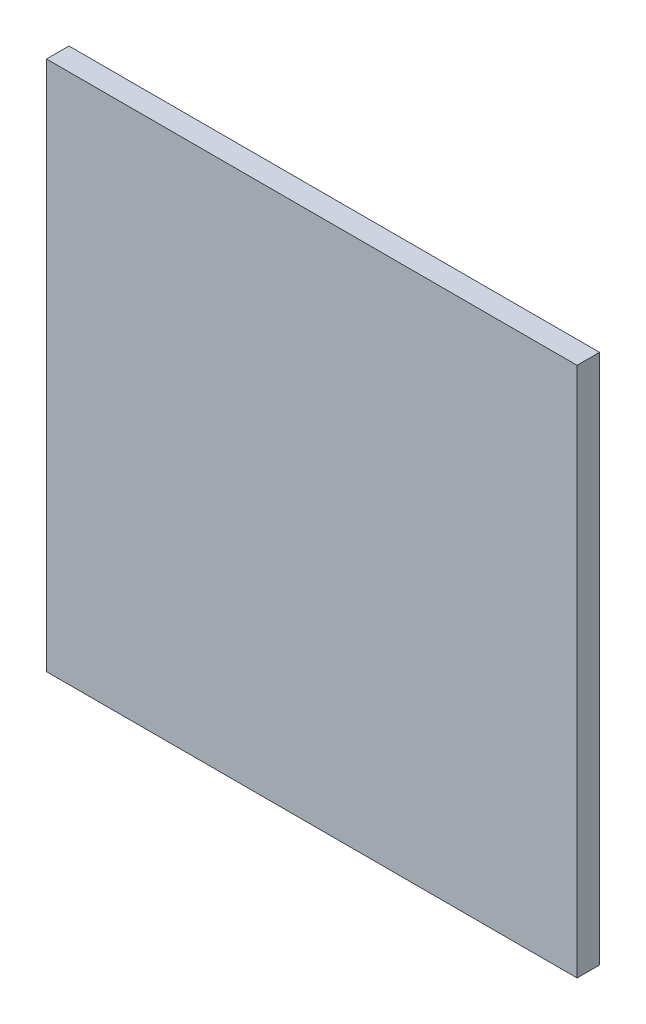
ISO-10303-21;
HEADER;
FILE_DESCRIPTION(('STEP AP214'),'2;1');
FILE_NAME('part.step','',(''),(''),'','','');
FILE_SCHEMA(('AUTOMOTIVE_DESIGN { 1 0 10303 214 1 1 1 1 }'));
ENDSEC;
DATA;
#1=APPLICATION_CONTEXT('core data for automotive mechanical design processes');
#2=APPLICATION_PROTOCOL_DEFINITION('international standard','automotive_design',2000,#1);
#3=PRODUCT_CONTEXT('',#1,'mechanical');
#4=PRODUCT('Part','Part','',(#3));
#5=PRODUCT_RELATED_PRODUCT_CATEGORY('part','',(#4));
#6=PRODUCT_DEFINITION_FORMATION('','',#4);
#7=PRODUCT_DEFINITION_CONTEXT('part definition',#1,'design');
#8=PRODUCT_DEFINITION('design','',#6,#7);
#9=PRODUCT_DEFINITION_SHAPE('','',#8);
#10=(LENGTH_UNIT() NAMED_UNIT(*) SI_UNIT(.MILLI.,.METRE.));
#11=(NAMED_UNIT(*) PLANE_ANGLE_UNIT() SI_UNIT($,.RADIAN.));
#12=(NAMED_UNIT(*) SI_UNIT($,.STERADIAN.) SOLID_ANGLE_UNIT());
#13=UNCERTAINTY_MEASURE_WITH_UNIT(LENGTH_MEASURE(1.E-05),#10,'distance_accuracy_value','');
#14=(GEOMETRIC_REPRESENTATION_CONTEXT(3) GLOBAL_UNCERTAINTY_ASSIGNED_CONTEXT((#13)) GLOBAL_UNIT_ASSIGNED_CONTEXT((#10,
#11,#12)) REPRESENTATION_CONTEXT('',''));
#15=CARTESIAN_POINT('',(0.,0.,0.));
#16=DIRECTION('',(0.,0.,1.));
#17=DIRECTION('',(1.,0.,0.));
#18=AXIS2_PLACEMENT_3D('',#15,#16,#17);
#19=CARTESIAN_POINT('',(0.,0.,0.55));
#20=DIRECTION('',(0.,0.,1.));
#21=DIRECTION('',(1.,0.,0.));
#22=AXIS2_PLACEMENT_3D('',#19,#20,#21);
#23=PLANE('',#22);
#24=DIRECTION('',(1.,0.,0.));
#25=VECTOR('',#24,1.);
#26=CARTESIAN_POINT('',(-6.5,-6.5,0.55));
#27=LINE('',#26,#25);
#28=CARTESIAN_POINT('',(6.5,-6.5,0.55));
#29=VERTEX_POINT('',#28);
#30=CARTESIAN_POINT('',(-6.5,-6.5,0.55));
#31=VERTEX_POINT('',#30);
#32=EDGE_CURVE('E67',#29,#31,#27,.F.);
#33=ORIENTED_EDGE('',*,*,#32,.F.);
#34=DIRECTION('',(0.,1.,0.));
#35=VECTOR('',#34,1.);
#36=CARTESIAN_POINT('',(6.5,-6.5,0.55));
#37=LINE('',#36,#35);
#38=CARTESIAN_POINT('',(6.5,6.5,0.55));
#39=VERTEX_POINT('',#38);
#40=EDGE_CURVE('E19',#39,#29,#37,.F.);
#41=ORIENTED_EDGE('',*,*,#40,.F.);
#42=DIRECTION('',(1.,0.,0.));
#43=VECTOR('',#42,1.);
#44=CARTESIAN_POINT('',(6.5,6.5,0.55));
#45=LINE('',#44,#43);
#46=CARTESIAN_POINT('',(-6.5,6.5,0.55));
#47=VERTEX_POINT('',#46);
#48=EDGE_CURVE('E57',#47,#39,#45,.T.);
#49=ORIENTED_EDGE('',*,*,#48,.F.);
#50=DIRECTION('',(0.,1.,0.));
#51=VECTOR('',#50,1.);
#52=CARTESIAN_POINT('',(-6.5,6.5,0.55));
#53=LINE('',#52,#51);
#54=EDGE_CURVE('E52',#31,#47,#53,.T.);
#55=ORIENTED_EDGE('',*,*,#54,.F.);
#56=EDGE_LOOP('',(#33,#41,#49,#55));
#57=FACE_BOUND('',#56,.T.);
#58=ADVANCED_FACE('F16',(#57),#23,.T.);
#59=CARTESIAN_POINT('',(6.5,-6.5,0.));
#60=DIRECTION('',(1.,0.,0.));
#61=DIRECTION('',(0.,0.,-1.));
#62=AXIS2_PLACEMENT_3D('',#59,#60,#61);
#63=PLANE('',#62);
#64=DIRECTION('',(0.,0.,-1.));
#65=VECTOR('',#64,1.);
#66=CARTESIAN_POINT('',(6.5,-6.5,0.));
#67=LINE('',#66,#65);
#68=CARTESIAN_POINT('',(6.5,-6.5,0.));
#69=VERTEX_POINT('',#68);
#70=EDGE_CURVE('E78',#69,#29,#67,.F.);
#71=ORIENTED_EDGE('',*,*,#70,.F.);
#72=DIRECTION('',(0.,1.,0.));
#73=VECTOR('',#72,1.);
#74=CARTESIAN_POINT('',(6.5,0.,0.));
#75=LINE('',#74,#73);
#76=CARTESIAN_POINT('',(6.5,6.5,0.));
#77=VERTEX_POINT('',#76);
#78=EDGE_CURVE('E73',#69,#77,#75,.T.);
#79=ORIENTED_EDGE('',*,*,#78,.T.);
#80=DIRECTION('',(0.,0.,1.));
#81=VECTOR('',#80,1.);
#82=CARTESIAN_POINT('',(6.5,6.5,0.));
#83=LINE('',#82,#81);
#84=EDGE_CURVE('E62',#39,#77,#83,.F.);
#85=ORIENTED_EDGE('',*,*,#84,.F.);
#86=ORIENTED_EDGE('',*,*,#40,.T.);
#87=EDGE_LOOP('',(#71,#79,#85,#86));
#88=FACE_BOUND('',#87,.T.);
#89=ADVANCED_FACE('F72',(#88),#63,.T.);
#90=CARTESIAN_POINT('',(6.5,6.5,0.));
#91=DIRECTION('',(0.,1.,0.));
#92=DIRECTION('',(0.,0.,1.));
#93=AXIS2_PLACEMENT_3D('',#90,#91,#92);
#94=PLANE('',#93);
#95=ORIENTED_EDGE('',*,*,#84,.T.);
#96=DIRECTION('',(1.,0.,0.));
#97=VECTOR('',#96,1.);
#98=CARTESIAN_POINT('',(0.,6.5,0.));
#99=LINE('',#98,#97);
#100=CARTESIAN_POINT('',(-6.5,6.5,0.));
#101=VERTEX_POINT('',#100);
#102=EDGE_CURVE('E83',#77,#101,#99,.F.);
#103=ORIENTED_EDGE('',*,*,#102,.T.);
#104=DIRECTION('',(0.,0.,1.));
#105=VECTOR('',#104,1.);
#106=CARTESIAN_POINT('',(-6.5,6.5,0.));
#107=LINE('',#106,#105);
#108=EDGE_CURVE('E64',#47,#101,#107,.F.);
#109=ORIENTED_EDGE('',*,*,#108,.F.);
#110=ORIENTED_EDGE('',*,*,#48,.T.);
#111=EDGE_LOOP('',(#95,#103,#109,#110));
#112=FACE_BOUND('',#111,.T.);
#113=ADVANCED_FACE('F59',(#112),#94,.T.);
#114=CARTESIAN_POINT('',(-6.5,6.5,0.));
#115=DIRECTION('',(-1.,0.,0.));
#116=DIRECTION('',(0.,0.,1.));
#117=AXIS2_PLACEMENT_3D('',#114,#115,#116);
#118=PLANE('',#117);
#119=ORIENTED_EDGE('',*,*,#108,.T.);
#120=DIRECTION('',(0.,1.,0.));
#121=VECTOR('',#120,1.);
#122=CARTESIAN_POINT('',(-6.5,0.,0.));
#123=LINE('',#122,#121);
#124=CARTESIAN_POINT('',(-6.5,-6.5,0.));
#125=VERTEX_POINT('',#124);
#126=EDGE_CURVE('E25',#101,#125,#123,.F.);
#127=ORIENTED_EDGE('',*,*,#126,.T.);
#128=DIRECTION('',(0.,0.,-1.));
#129=VECTOR('',#128,1.);
#130=CARTESIAN_POINT('',(-6.5,-6.5,0.));
#131=LINE('',#130,#129);
#132=EDGE_CURVE('E33',#31,#125,#131,.T.);
#133=ORIENTED_EDGE('',*,*,#132,.F.);
#134=ORIENTED_EDGE('',*,*,#54,.T.);
#135=EDGE_LOOP('',(#119,#127,#133,#134));
#136=FACE_BOUND('',#135,.T.);
#137=ADVANCED_FACE('F87',(#136),#118,.T.);
#138=CARTESIAN_POINT('',(-6.5,-6.5,0.));
#139=DIRECTION('',(0.,-1.,0.));
#140=DIRECTION('',(0.,0.,-1.));
#141=AXIS2_PLACEMENT_3D('',#138,#139,#140);
#142=PLANE('',#141);
#143=ORIENTED_EDGE('',*,*,#132,.T.);
#144=DIRECTION('',(1.,0.,0.));
#145=VECTOR('',#144,1.);
#146=CARTESIAN_POINT('',(0.,-6.5,0.));
#147=LINE('',#146,#145);
#148=EDGE_CURVE('E11',#125,#69,#147,.T.);
#149=ORIENTED_EDGE('',*,*,#148,.T.);
#150=ORIENTED_EDGE('',*,*,#70,.T.);
#151=ORIENTED_EDGE('',*,*,#32,.T.);
#152=EDGE_LOOP('',(#143,#149,#150,#151));
#153=FACE_BOUND('',#152,.T.);
#154=ADVANCED_FACE('F90',(#153),#142,.T.);
#155=CARTESIAN_POINT('',(0.,0.,0.));
#156=DIRECTION('',(0.,0.,1.));
#157=DIRECTION('',(1.,0.,0.));
#158=AXIS2_PLACEMENT_3D('',#155,#156,#157);
#159=PLANE('',#158);
#160=ORIENTED_EDGE('',*,*,#126,.F.);
#161=ORIENTED_EDGE('',*,*,#102,.F.);
#162=ORIENTED_EDGE('',*,*,#78,.F.);
#163=ORIENTED_EDGE('',*,*,#148,.F.);
#164=EDGE_LOOP('',(#160,#161,#162,#163));
#165=FACE_BOUND('',#164,.T.);
#166=ADVANCED_FACE('F89',(#165),#159,.F.);
#167=CLOSED_SHELL('',(#58,#89,#113,#137,#154,#166));
#168=MANIFOLD_SOLID_BREP('B1',#167);
#169=ADVANCED_BREP_SHAPE_REPRESENTATION('',(#18,#168),#14);
#170=SHAPE_DEFINITION_REPRESENTATION(#9,#169);
ENDSEC;
END-ISO-10303-21;
